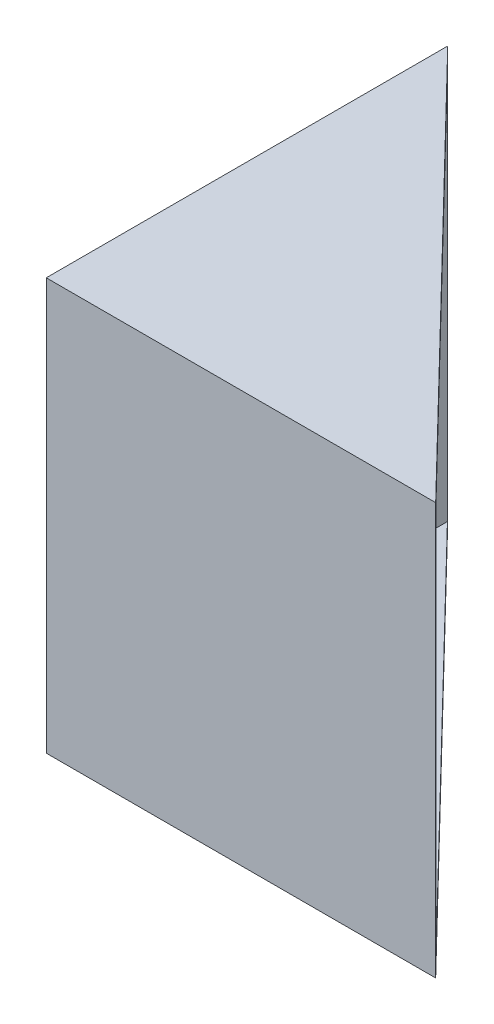
ISO-10303-21;
HEADER;
FILE_DESCRIPTION(('STEP AP214'),'2;1');
FILE_NAME('part.step','',(''),(''),'','','');
FILE_SCHEMA(('AUTOMOTIVE_DESIGN { 1 0 10303 214 1 1 1 1 }'));
ENDSEC;
DATA;
#1=APPLICATION_CONTEXT('core data for automotive mechanical design processes');
#2=APPLICATION_PROTOCOL_DEFINITION('international standard','automotive_design',2000,#1);
#3=PRODUCT_CONTEXT('',#1,'mechanical');
#4=PRODUCT('Part','Part','',(#3));
#5=PRODUCT_RELATED_PRODUCT_CATEGORY('part','',(#4));
#6=PRODUCT_DEFINITION_FORMATION('','',#4);
#7=PRODUCT_DEFINITION_CONTEXT('part definition',#1,'design');
#8=PRODUCT_DEFINITION('design','',#6,#7);
#9=PRODUCT_DEFINITION_SHAPE('','',#8);
#10=(LENGTH_UNIT() NAMED_UNIT(*) SI_UNIT(.MILLI.,.METRE.));
#11=(NAMED_UNIT(*) PLANE_ANGLE_UNIT() SI_UNIT($,.RADIAN.));
#12=(NAMED_UNIT(*) SI_UNIT($,.STERADIAN.) SOLID_ANGLE_UNIT());
#13=UNCERTAINTY_MEASURE_WITH_UNIT(LENGTH_MEASURE(1.E-05),#10,'distance_accuracy_value','');
#14=(GEOMETRIC_REPRESENTATION_CONTEXT(3) GLOBAL_UNCERTAINTY_ASSIGNED_CONTEXT((#13)) GLOBAL_UNIT_ASSIGNED_CONTEXT((#10,
#11,#12)) REPRESENTATION_CONTEXT('',''));
#15=CARTESIAN_POINT('',(0.,0.,0.));
#16=DIRECTION('',(0.,0.,1.));
#17=DIRECTION('',(1.,0.,0.));
#18=AXIS2_PLACEMENT_3D('',#15,#16,#17);
#19=CARTESIAN_POINT('',(-22.5,80.,-55.5143310912035));
#20=DIRECTION('',(-0.717816517955114,0.,0.696232322253712));
#21=DIRECTION('',(0.696232322253712,0.,0.717816517955114));
#22=AXIS2_PLACEMENT_3D('',#19,#20,#21);
#23=PLANE('',#22);
#24=DIRECTION('',(-0.696232322253712,0.,-0.717816517955113));
#25=VECTOR('',#24,1.);
#26=CARTESIAN_POINT('',(-22.5,0.,-55.5143310912035));
#27=LINE('',#26,#25);
#28=CARTESIAN_POINT('',(53.1684996040939,0.,22.5));
#29=VERTEX_POINT('',#28);
#30=CARTESIAN_POINT('',(-22.5,0.,-55.5143310912035));
#31=VERTEX_POINT('',#30);
#32=EDGE_CURVE('E84',#29,#31,#27,.T.);
#33=ORIENTED_EDGE('',*,*,#32,.T.);
#34=DIRECTION('',(0.,-1.,0.));
#35=VECTOR('',#34,1.);
#36=CARTESIAN_POINT('',(-22.5,80.,-55.5143310912035));
#37=LINE('',#36,#35);
#38=CARTESIAN_POINT('',(-22.5,80.,-55.5143310912035));
#39=VERTEX_POINT('',#38);
#40=EDGE_CURVE('E141',#39,#31,#37,.T.);
#41=ORIENTED_EDGE('',*,*,#40,.F.);
#42=DIRECTION('',(-0.696232322253712,0.,-0.717816517955113));
#43=VECTOR('',#42,1.);
#44=CARTESIAN_POINT('',(-22.5,80.,-55.5143310912035));
#45=LINE('',#44,#43);
#46=CARTESIAN_POINT('',(53.1684996040939,80.,22.5));
#47=VERTEX_POINT('',#46);
#48=EDGE_CURVE('E67',#47,#39,#45,.T.);
#49=ORIENTED_EDGE('',*,*,#48,.F.);
#50=DIRECTION('',(0.,-1.,0.));
#51=VECTOR('',#50,1.);
#52=CARTESIAN_POINT('',(53.1684996040939,80.,22.5));
#53=LINE('',#52,#51);
#54=EDGE_CURVE('E51',#47,#29,#53,.T.);
#55=ORIENTED_EDGE('',*,*,#54,.T.);
#56=EDGE_LOOP('',(#33,#41,#49,#55));
#57=FACE_BOUND('',#56,.T.);
#58=DIRECTION('',(-0.696232322253712,0.,-0.717816517955114));
#59=VECTOR('',#58,1.);
#60=CARTESIAN_POINT('',(16.1508716539901,2.,-15.6652272507085));
#61=LINE('',#60,#59);
#62=CARTESIAN_POINT('',(51.2286380800456,2.,20.5));
#63=VERTEX_POINT('',#62);
#64=CARTESIAN_POINT('',(-20.5,2.,-53.4523282366634));
#65=VERTEX_POINT('',#64);
#66=EDGE_CURVE('E115',#63,#65,#61,.T.);
#67=ORIENTED_EDGE('',*,*,#66,.F.);
#68=DIRECTION('',(0.,-1.,0.));
#69=VECTOR('',#68,1.);
#70=CARTESIAN_POINT('',(51.2286380800456,80.,20.5));
#71=LINE('',#70,#69);
#72=CARTESIAN_POINT('',(51.2286380800456,78.,20.5));
#73=VERTEX_POINT('',#72);
#74=EDGE_CURVE('E111',#73,#63,#71,.T.);
#75=ORIENTED_EDGE('',*,*,#74,.F.);
#76=DIRECTION('',(-0.696232322253712,0.,-0.717816517955114));
#77=VECTOR('',#76,1.);
#78=CARTESIAN_POINT('',(16.1508716539901,78.,-15.6652272507085));
#79=LINE('',#78,#77);
#80=CARTESIAN_POINT('',(-20.5,78.,-53.4523282366634));
#81=VERTEX_POINT('',#80);
#82=EDGE_CURVE('E58',#73,#81,#79,.T.);
#83=ORIENTED_EDGE('',*,*,#82,.T.);
#84=DIRECTION('',(0.,-1.,0.));
#85=VECTOR('',#84,1.);
#86=CARTESIAN_POINT('',(-20.5,80.,-53.4523282366634));
#87=LINE('',#86,#85);
#88=EDGE_CURVE('E132',#81,#65,#87,.T.);
#89=ORIENTED_EDGE('',*,*,#88,.T.);
#90=EDGE_LOOP('',(#67,#75,#83,#89));
#91=FACE_BOUND('',#90,.T.);
#92=ADVANCED_FACE('F43',(#57,#91),#23,.F.);
#93=CARTESIAN_POINT('',(-22.5,80.,22.5));
#94=DIRECTION('',(1.,0.,0.));
#95=DIRECTION('',(0.,0.,-1.));
#96=AXIS2_PLACEMENT_3D('',#93,#94,#95);
#97=PLANE('',#96);
#98=DIRECTION('',(0.,0.,1.));
#99=VECTOR('',#98,1.);
#100=CARTESIAN_POINT('',(-22.5,0.,22.5));
#101=LINE('',#100,#99);
#102=CARTESIAN_POINT('',(-22.5,0.,22.5));
#103=VERTEX_POINT('',#102);
#104=EDGE_CURVE('E124',#31,#103,#101,.T.);
#105=ORIENTED_EDGE('',*,*,#104,.T.);
#106=DIRECTION('',(0.,-1.,0.));
#107=VECTOR('',#106,1.);
#108=CARTESIAN_POINT('',(-22.5,80.,22.5));
#109=LINE('',#108,#107);
#110=CARTESIAN_POINT('',(-22.5,80.,22.5));
#111=VERTEX_POINT('',#110);
#112=EDGE_CURVE('E11',#111,#103,#109,.T.);
#113=ORIENTED_EDGE('',*,*,#112,.F.);
#114=DIRECTION('',(0.,0.,1.));
#115=VECTOR('',#114,1.);
#116=CARTESIAN_POINT('',(-22.5,80.,22.5));
#117=LINE('',#116,#115);
#118=EDGE_CURVE('E137',#39,#111,#117,.T.);
#119=ORIENTED_EDGE('',*,*,#118,.F.);
#120=ORIENTED_EDGE('',*,*,#40,.T.);
#121=EDGE_LOOP('',(#105,#113,#119,#120));
#122=FACE_BOUND('',#121,.T.);
#123=ADVANCED_FACE('F45',(#122),#97,.F.);
#124=CARTESIAN_POINT('',(-22.5,80.,22.5));
#125=DIRECTION('',(0.,0.,-1.));
#126=DIRECTION('',(-1.,0.,0.));
#127=AXIS2_PLACEMENT_3D('',#124,#125,#126);
#128=PLANE('',#127);
#129=DIRECTION('',(1.,0.,0.));
#130=VECTOR('',#129,1.);
#131=CARTESIAN_POINT('',(-22.5,0.,22.5));
#132=LINE('',#131,#130);
#133=EDGE_CURVE('E144',#103,#29,#132,.T.);
#134=ORIENTED_EDGE('',*,*,#133,.T.);
#135=ORIENTED_EDGE('',*,*,#54,.F.);
#136=DIRECTION('',(1.,0.,0.));
#137=VECTOR('',#136,1.);
#138=CARTESIAN_POINT('',(-22.5,80.,22.5));
#139=LINE('',#138,#137);
#140=EDGE_CURVE('E89',#111,#47,#139,.T.);
#141=ORIENTED_EDGE('',*,*,#140,.F.);
#142=ORIENTED_EDGE('',*,*,#112,.T.);
#143=EDGE_LOOP('',(#134,#135,#141,#142));
#144=FACE_BOUND('',#143,.T.);
#145=ADVANCED_FACE('F156',(#144),#128,.F.);
#146=CARTESIAN_POINT('',(0.,80.,0.));
#147=DIRECTION('',(0.,-1.,0.));
#148=DIRECTION('',(0.,0.,-1.));
#149=AXIS2_PLACEMENT_3D('',#146,#147,#148);
#150=PLANE('',#149);
#151=ORIENTED_EDGE('',*,*,#118,.T.);
#152=ORIENTED_EDGE('',*,*,#140,.T.);
#153=ORIENTED_EDGE('',*,*,#48,.T.);
#154=EDGE_LOOP('',(#151,#152,#153));
#155=FACE_BOUND('',#154,.T.);
#156=ADVANCED_FACE('F154',(#155),#150,.F.);
#157=CARTESIAN_POINT('',(0.,0.,0.));
#158=DIRECTION('',(0.,-1.,0.));
#159=DIRECTION('',(0.,0.,-1.));
#160=AXIS2_PLACEMENT_3D('',#157,#158,#159);
#161=PLANE('',#160);
#162=ORIENTED_EDGE('',*,*,#104,.F.);
#163=ORIENTED_EDGE('',*,*,#32,.F.);
#164=ORIENTED_EDGE('',*,*,#133,.F.);
#165=EDGE_LOOP('',(#162,#163,#164));
#166=FACE_BOUND('',#165,.T.);
#167=ADVANCED_FACE('F150',(#166),#161,.T.);
#168=CARTESIAN_POINT('',(-20.5,80.,22.5));
#169=DIRECTION('',(1.,0.,0.));
#170=DIRECTION('',(0.,0.,-1.));
#171=AXIS2_PLACEMENT_3D('',#168,#169,#170);
#172=PLANE('',#171);
#173=DIRECTION('',(0.,0.,1.));
#174=VECTOR('',#173,1.);
#175=CARTESIAN_POINT('',(-20.5,2.,0.));
#176=LINE('',#175,#174);
#177=CARTESIAN_POINT('',(-20.5,2.,20.5));
#178=VERTEX_POINT('',#177);
#179=EDGE_CURVE('E116',#65,#178,#176,.T.);
#180=ORIENTED_EDGE('',*,*,#179,.F.);
#181=ORIENTED_EDGE('',*,*,#88,.F.);
#182=DIRECTION('',(0.,0.,1.));
#183=VECTOR('',#182,1.);
#184=CARTESIAN_POINT('',(-20.5,78.,0.));
#185=LINE('',#184,#183);
#186=CARTESIAN_POINT('',(-20.5,78.,20.5));
#187=VERTEX_POINT('',#186);
#188=EDGE_CURVE('E123',#81,#187,#185,.T.);
#189=ORIENTED_EDGE('',*,*,#188,.T.);
#190=DIRECTION('',(0.,-1.,0.));
#191=VECTOR('',#190,1.);
#192=CARTESIAN_POINT('',(-20.5,80.,20.5));
#193=LINE('',#192,#191);
#194=EDGE_CURVE('E109',#187,#178,#193,.T.);
#195=ORIENTED_EDGE('',*,*,#194,.T.);
#196=EDGE_LOOP('',(#180,#181,#189,#195));
#197=FACE_BOUND('',#196,.T.);
#198=ADVANCED_FACE('F121',(#197),#172,.T.);
#199=CARTESIAN_POINT('',(-22.5,80.,20.5));
#200=DIRECTION('',(0.,0.,-1.));
#201=DIRECTION('',(-1.,0.,0.));
#202=AXIS2_PLACEMENT_3D('',#199,#200,#201);
#203=PLANE('',#202);
#204=DIRECTION('',(1.,0.,0.));
#205=VECTOR('',#204,1.);
#206=CARTESIAN_POINT('',(0.,2.,20.5));
#207=LINE('',#206,#205);
#208=EDGE_CURVE('E106',#178,#63,#207,.T.);
#209=ORIENTED_EDGE('',*,*,#208,.F.);
#210=ORIENTED_EDGE('',*,*,#194,.F.);
#211=DIRECTION('',(1.,0.,0.));
#212=VECTOR('',#211,1.);
#213=CARTESIAN_POINT('',(0.,78.,20.5));
#214=LINE('',#213,#212);
#215=EDGE_CURVE('E129',#187,#73,#214,.T.);
#216=ORIENTED_EDGE('',*,*,#215,.T.);
#217=ORIENTED_EDGE('',*,*,#74,.T.);
#218=EDGE_LOOP('',(#209,#210,#216,#217));
#219=FACE_BOUND('',#218,.T.);
#220=ADVANCED_FACE('F108',(#219),#203,.T.);
#221=CARTESIAN_POINT('',(0.,78.,0.));
#222=DIRECTION('',(0.,-1.,0.));
#223=DIRECTION('',(0.,0.,-1.));
#224=AXIS2_PLACEMENT_3D('',#221,#222,#223);
#225=PLANE('',#224);
#226=ORIENTED_EDGE('',*,*,#188,.F.);
#227=ORIENTED_EDGE('',*,*,#82,.F.);
#228=ORIENTED_EDGE('',*,*,#215,.F.);
#229=EDGE_LOOP('',(#226,#227,#228));
#230=FACE_BOUND('',#229,.T.);
#231=ADVANCED_FACE('F196',(#230),#225,.T.);
#232=CARTESIAN_POINT('',(0.,2.,0.));
#233=DIRECTION('',(0.,-1.,0.));
#234=DIRECTION('',(0.,0.,-1.));
#235=AXIS2_PLACEMENT_3D('',#232,#233,#234);
#236=PLANE('',#235);
#237=ORIENTED_EDGE('',*,*,#179,.T.);
#238=ORIENTED_EDGE('',*,*,#208,.T.);
#239=ORIENTED_EDGE('',*,*,#66,.T.);
#240=EDGE_LOOP('',(#237,#238,#239));
#241=FACE_BOUND('',#240,.T.);
#242=ADVANCED_FACE('F126',(#241),#236,.F.);
#243=CLOSED_SHELL('',(#92,#123,#145,#156,#167,#198,#220,#231,#242));
#244=MANIFOLD_SOLID_BREP('B2',#243);
#245=ADVANCED_BREP_SHAPE_REPRESENTATION('',(#18,#244),#14);
#246=SHAPE_DEFINITION_REPRESENTATION(#9,#245);
ENDSEC;
END-ISO-10303-21;
